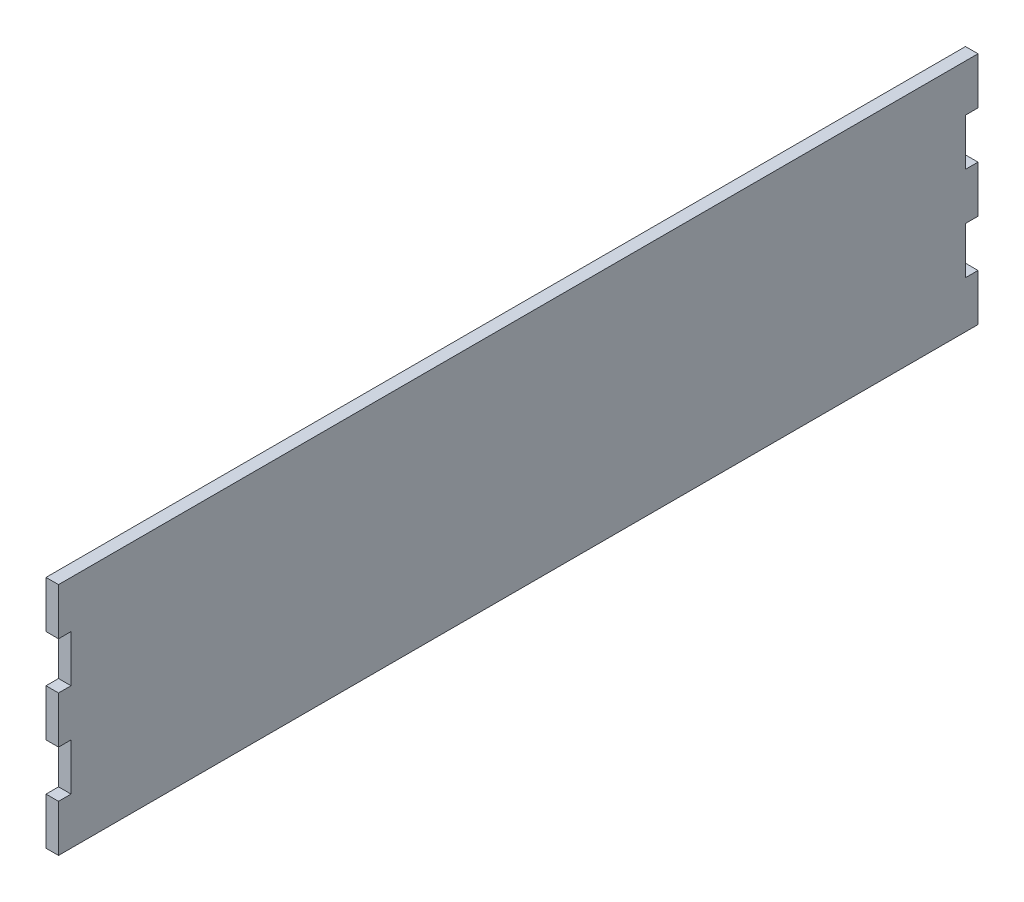
ISO-10303-21;
HEADER;
FILE_DESCRIPTION(('STEP AP214'),'2;1');
FILE_NAME('part.step','',(''),(''),'','','');
FILE_SCHEMA(('AUTOMOTIVE_DESIGN { 1 0 10303 214 1 1 1 1 }'));
ENDSEC;
DATA;
#1=APPLICATION_CONTEXT('core data for automotive mechanical design processes');
#2=APPLICATION_PROTOCOL_DEFINITION('international standard','automotive_design',2000,#1);
#3=PRODUCT_CONTEXT('',#1,'mechanical');
#4=PRODUCT('Part','Part','',(#3));
#5=PRODUCT_RELATED_PRODUCT_CATEGORY('part','',(#4));
#6=PRODUCT_DEFINITION_FORMATION('','',#4);
#7=PRODUCT_DEFINITION_CONTEXT('part definition',#1,'design');
#8=PRODUCT_DEFINITION('design','',#6,#7);
#9=PRODUCT_DEFINITION_SHAPE('','',#8);
#10=(LENGTH_UNIT() NAMED_UNIT(*) SI_UNIT(.MILLI.,.METRE.));
#11=(NAMED_UNIT(*) PLANE_ANGLE_UNIT() SI_UNIT($,.RADIAN.));
#12=(NAMED_UNIT(*) SI_UNIT($,.STERADIAN.) SOLID_ANGLE_UNIT());
#13=UNCERTAINTY_MEASURE_WITH_UNIT(LENGTH_MEASURE(1.E-05),#10,'distance_accuracy_value','');
#14=(GEOMETRIC_REPRESENTATION_CONTEXT(3) GLOBAL_UNCERTAINTY_ASSIGNED_CONTEXT((#13)) GLOBAL_UNIT_ASSIGNED_CONTEXT((#10,
#11,#12)) REPRESENTATION_CONTEXT('',''));
#15=CARTESIAN_POINT('',(0.,0.,0.));
#16=DIRECTION('',(0.,0.,1.));
#17=DIRECTION('',(1.,0.,0.));
#18=AXIS2_PLACEMENT_3D('',#15,#16,#17);
#19=CARTESIAN_POINT('',(4.,-7.74816910527764,-147.));
#20=DIRECTION('',(0.,1.,0.));
#21=DIRECTION('',(0.,0.,1.));
#22=AXIS2_PLACEMENT_3D('',#19,#20,#21);
#23=PLANE('',#22);
#24=DIRECTION('',(0.,0.,-1.));
#25=VECTOR('',#24,1.);
#26=CARTESIAN_POINT('',(0.,-7.74816910527764,-147.));
#27=LINE('',#26,#25);
#28=CARTESIAN_POINT('',(0.,-7.74816910527764,-143.));
#29=VERTEX_POINT('',#28);
#30=CARTESIAN_POINT('',(0.,-7.74816910527764,-147.));
#31=VERTEX_POINT('',#30);
#32=EDGE_CURVE('E206',#29,#31,#27,.T.);
#33=ORIENTED_EDGE('',*,*,#32,.T.);
#34=DIRECTION('',(-1.,0.,0.));
#35=VECTOR('',#34,1.);
#36=CARTESIAN_POINT('',(4.,-7.74816910527764,-147.));
#37=LINE('',#36,#35);
#38=CARTESIAN_POINT('',(4.,-7.74816910527764,-147.));
#39=VERTEX_POINT('',#38);
#40=EDGE_CURVE('E11',#39,#31,#37,.T.);
#41=ORIENTED_EDGE('',*,*,#40,.F.);
#42=DIRECTION('',(0.,0.,-1.));
#43=VECTOR('',#42,1.);
#44=CARTESIAN_POINT('',(4.,-7.74816910527764,-147.));
#45=LINE('',#44,#43);
#46=CARTESIAN_POINT('',(4.,-7.74816910527764,-143.));
#47=VERTEX_POINT('',#46);
#48=EDGE_CURVE('E244',#47,#39,#45,.T.);
#49=ORIENTED_EDGE('',*,*,#48,.F.);
#50=DIRECTION('',(-1.,0.,0.));
#51=VECTOR('',#50,1.);
#52=CARTESIAN_POINT('',(4.,-7.74816910527764,-143.));
#53=LINE('',#52,#51);
#54=EDGE_CURVE('E202',#47,#29,#53,.T.);
#55=ORIENTED_EDGE('',*,*,#54,.T.);
#56=EDGE_LOOP('',(#33,#41,#49,#55));
#57=FACE_BOUND('',#56,.T.);
#58=ADVANCED_FACE('F38',(#57),#23,.F.);
#59=CARTESIAN_POINT('',(4.,7.25183089472235,-147.));
#60=DIRECTION('',(0.,0.,1.));
#61=DIRECTION('',(0.,-1.,0.));
#62=AXIS2_PLACEMENT_3D('',#59,#60,#61);
#63=PLANE('',#62);
#64=DIRECTION('',(0.,1.,0.));
#65=VECTOR('',#64,1.);
#66=CARTESIAN_POINT('',(0.,7.25183089472235,-147.));
#67=LINE('',#66,#65);
#68=CARTESIAN_POINT('',(0.,7.25183089472235,-147.));
#69=VERTEX_POINT('',#68);
#70=EDGE_CURVE('E209',#31,#69,#67,.T.);
#71=ORIENTED_EDGE('',*,*,#70,.T.);
#72=DIRECTION('',(-1.,0.,0.));
#73=VECTOR('',#72,1.);
#74=CARTESIAN_POINT('',(4.,7.25183089472235,-147.));
#75=LINE('',#74,#73);
#76=CARTESIAN_POINT('',(4.,7.25183089472235,-147.));
#77=VERTEX_POINT('',#76);
#78=EDGE_CURVE('E46',#77,#69,#75,.T.);
#79=ORIENTED_EDGE('',*,*,#78,.F.);
#80=DIRECTION('',(0.,1.,0.));
#81=VECTOR('',#80,1.);
#82=CARTESIAN_POINT('',(4.,7.25183089472235,-147.));
#83=LINE('',#82,#81);
#84=EDGE_CURVE('E133',#39,#77,#83,.T.);
#85=ORIENTED_EDGE('',*,*,#84,.F.);
#86=ORIENTED_EDGE('',*,*,#40,.T.);
#87=EDGE_LOOP('',(#71,#79,#85,#86));
#88=FACE_BOUND('',#87,.T.);
#89=ADVANCED_FACE('F362',(#88),#63,.F.);
#90=CARTESIAN_POINT('',(4.,7.25183089472235,-147.));
#91=DIRECTION('',(0.,-1.,0.));
#92=DIRECTION('',(0.,0.,-1.));
#93=AXIS2_PLACEMENT_3D('',#90,#91,#92);
#94=PLANE('',#93);
#95=DIRECTION('',(0.,0.,1.));
#96=VECTOR('',#95,1.);
#97=CARTESIAN_POINT('',(0.,7.25183089472235,-147.));
#98=LINE('',#97,#96);
#99=CARTESIAN_POINT('',(0.,7.25183089472235,-143.));
#100=VERTEX_POINT('',#99);
#101=EDGE_CURVE('E211',#69,#100,#98,.T.);
#102=ORIENTED_EDGE('',*,*,#101,.T.);
#103=DIRECTION('',(-1.,0.,0.));
#104=VECTOR('',#103,1.);
#105=CARTESIAN_POINT('',(4.,7.25183089472235,-143.));
#106=LINE('',#105,#104);
#107=CARTESIAN_POINT('',(4.,7.25183089472235,-143.));
#108=VERTEX_POINT('',#107);
#109=EDGE_CURVE('E287',#108,#100,#106,.T.);
#110=ORIENTED_EDGE('',*,*,#109,.F.);
#111=DIRECTION('',(0.,0.,1.));
#112=VECTOR('',#111,1.);
#113=CARTESIAN_POINT('',(4.,7.25183089472235,-147.));
#114=LINE('',#113,#112);
#115=EDGE_CURVE('E295',#77,#108,#114,.T.);
#116=ORIENTED_EDGE('',*,*,#115,.F.);
#117=ORIENTED_EDGE('',*,*,#78,.T.);
#118=EDGE_LOOP('',(#102,#110,#116,#117));
#119=FACE_BOUND('',#118,.T.);
#120=ADVANCED_FACE('F293',(#119),#94,.F.);
#121=CARTESIAN_POINT('',(4.,22.2518308947224,-143.));
#122=DIRECTION('',(0.,0.,1.));
#123=DIRECTION('',(0.,-1.,0.));
#124=AXIS2_PLACEMENT_3D('',#121,#122,#123);
#125=PLANE('',#124);
#126=DIRECTION('',(0.,1.,0.));
#127=VECTOR('',#126,1.);
#128=CARTESIAN_POINT('',(0.,22.2518308947224,-143.));
#129=LINE('',#128,#127);
#130=CARTESIAN_POINT('',(0.,22.2518308947224,-143.));
#131=VERTEX_POINT('',#130);
#132=EDGE_CURVE('E213',#100,#131,#129,.T.);
#133=ORIENTED_EDGE('',*,*,#132,.T.);
#134=DIRECTION('',(-1.,0.,0.));
#135=VECTOR('',#134,1.);
#136=CARTESIAN_POINT('',(4.,22.2518308947224,-143.));
#137=LINE('',#136,#135);
#138=CARTESIAN_POINT('',(4.,22.2518308947224,-143.));
#139=VERTEX_POINT('',#138);
#140=EDGE_CURVE('E284',#139,#131,#137,.T.);
#141=ORIENTED_EDGE('',*,*,#140,.F.);
#142=DIRECTION('',(0.,1.,0.));
#143=VECTOR('',#142,1.);
#144=CARTESIAN_POINT('',(4.,22.2518308947224,-143.));
#145=LINE('',#144,#143);
#146=EDGE_CURVE('E313',#108,#139,#145,.T.);
#147=ORIENTED_EDGE('',*,*,#146,.F.);
#148=ORIENTED_EDGE('',*,*,#109,.T.);
#149=EDGE_LOOP('',(#133,#141,#147,#148));
#150=FACE_BOUND('',#149,.T.);
#151=ADVANCED_FACE('F304',(#150),#125,.F.);
#152=CARTESIAN_POINT('',(4.,22.2518308947224,-147.));
#153=DIRECTION('',(0.,1.,0.));
#154=DIRECTION('',(0.,0.,1.));
#155=AXIS2_PLACEMENT_3D('',#152,#153,#154);
#156=PLANE('',#155);
#157=DIRECTION('',(0.,0.,-1.));
#158=VECTOR('',#157,1.);
#159=CARTESIAN_POINT('',(0.,22.2518308947224,-147.));
#160=LINE('',#159,#158);
#161=CARTESIAN_POINT('',(0.,22.2518308947224,-147.));
#162=VERTEX_POINT('',#161);
#163=EDGE_CURVE('E215',#131,#162,#160,.T.);
#164=ORIENTED_EDGE('',*,*,#163,.T.);
#165=DIRECTION('',(-1.,0.,0.));
#166=VECTOR('',#165,1.);
#167=CARTESIAN_POINT('',(4.,22.2518308947224,-147.));
#168=LINE('',#167,#166);
#169=CARTESIAN_POINT('',(4.,22.2518308947224,-147.));
#170=VERTEX_POINT('',#169);
#171=EDGE_CURVE('E281',#170,#162,#168,.T.);
#172=ORIENTED_EDGE('',*,*,#171,.F.);
#173=DIRECTION('',(0.,0.,-1.));
#174=VECTOR('',#173,1.);
#175=CARTESIAN_POINT('',(4.,22.2518308947224,-147.));
#176=LINE('',#175,#174);
#177=EDGE_CURVE('E310',#139,#170,#176,.T.);
#178=ORIENTED_EDGE('',*,*,#177,.F.);
#179=ORIENTED_EDGE('',*,*,#140,.T.);
#180=EDGE_LOOP('',(#164,#172,#178,#179));
#181=FACE_BOUND('',#180,.T.);
#182=ADVANCED_FACE('F308',(#181),#156,.F.);
#183=CARTESIAN_POINT('',(4.,37.2518308947224,-147.));
#184=DIRECTION('',(0.,0.,1.));
#185=DIRECTION('',(1.,0.,0.));
#186=AXIS2_PLACEMENT_3D('',#183,#184,#185);
#187=PLANE('',#186);
#188=DIRECTION('',(0.,1.,0.));
#189=VECTOR('',#188,1.);
#190=CARTESIAN_POINT('',(0.,37.2518308947224,-147.));
#191=LINE('',#190,#189);
#192=CARTESIAN_POINT('',(0.,37.2518308947224,-147.));
#193=VERTEX_POINT('',#192);
#194=EDGE_CURVE('E217',#162,#193,#191,.T.);
#195=ORIENTED_EDGE('',*,*,#194,.T.);
#196=DIRECTION('',(-1.,0.,0.));
#197=VECTOR('',#196,1.);
#198=CARTESIAN_POINT('',(4.,37.2518308947224,-147.));
#199=LINE('',#198,#197);
#200=CARTESIAN_POINT('',(4.,37.2518308947224,-147.));
#201=VERTEX_POINT('',#200);
#202=EDGE_CURVE('E278',#201,#193,#199,.T.);
#203=ORIENTED_EDGE('',*,*,#202,.F.);
#204=DIRECTION('',(0.,1.,0.));
#205=VECTOR('',#204,1.);
#206=CARTESIAN_POINT('',(4.,37.2518308947224,-147.));
#207=LINE('',#206,#205);
#208=EDGE_CURVE('E312',#170,#201,#207,.T.);
#209=ORIENTED_EDGE('',*,*,#208,.F.);
#210=ORIENTED_EDGE('',*,*,#171,.T.);
#211=EDGE_LOOP('',(#195,#203,#209,#210));
#212=FACE_BOUND('',#211,.T.);
#213=ADVANCED_FACE('F375',(#212),#187,.F.);
#214=CARTESIAN_POINT('',(4.,37.2518308947223,147.));
#215=DIRECTION('',(0.,-1.,0.));
#216=DIRECTION('',(0.,0.,-1.));
#217=AXIS2_PLACEMENT_3D('',#214,#215,#216);
#218=PLANE('',#217);
#219=DIRECTION('',(0.,0.,1.));
#220=VECTOR('',#219,1.);
#221=CARTESIAN_POINT('',(0.,37.2518308947223,147.));
#222=LINE('',#221,#220);
#223=CARTESIAN_POINT('',(0.,37.2518308947223,147.));
#224=VERTEX_POINT('',#223);
#225=EDGE_CURVE('E219',#193,#224,#222,.T.);
#226=ORIENTED_EDGE('',*,*,#225,.T.);
#227=DIRECTION('',(-1.,0.,0.));
#228=VECTOR('',#227,1.);
#229=CARTESIAN_POINT('',(4.,37.2518308947223,147.));
#230=LINE('',#229,#228);
#231=CARTESIAN_POINT('',(4.,37.2518308947223,147.));
#232=VERTEX_POINT('',#231);
#233=EDGE_CURVE('E275',#232,#224,#230,.T.);
#234=ORIENTED_EDGE('',*,*,#233,.F.);
#235=DIRECTION('',(0.,0.,1.));
#236=VECTOR('',#235,1.);
#237=CARTESIAN_POINT('',(4.,37.2518308947223,147.));
#238=LINE('',#237,#236);
#239=EDGE_CURVE('E315',#201,#232,#238,.T.);
#240=ORIENTED_EDGE('',*,*,#239,.F.);
#241=ORIENTED_EDGE('',*,*,#202,.T.);
#242=EDGE_LOOP('',(#226,#234,#240,#241));
#243=FACE_BOUND('',#242,.T.);
#244=ADVANCED_FACE('F378',(#243),#218,.F.);
#245=CARTESIAN_POINT('',(4.,37.2518308947223,147.));
#246=DIRECTION('',(0.,0.,-1.));
#247=DIRECTION('',(-1.,0.,0.));
#248=AXIS2_PLACEMENT_3D('',#245,#246,#247);
#249=PLANE('',#248);
#250=DIRECTION('',(0.,-1.,0.));
#251=VECTOR('',#250,1.);
#252=CARTESIAN_POINT('',(0.,37.2518308947223,147.));
#253=LINE('',#252,#251);
#254=CARTESIAN_POINT('',(0.,22.2518308947223,147.));
#255=VERTEX_POINT('',#254);
#256=EDGE_CURVE('E221',#224,#255,#253,.T.);
#257=ORIENTED_EDGE('',*,*,#256,.T.);
#258=DIRECTION('',(-1.,0.,0.));
#259=VECTOR('',#258,1.);
#260=CARTESIAN_POINT('',(4.,22.2518308947223,147.));
#261=LINE('',#260,#259);
#262=CARTESIAN_POINT('',(4.,22.2518308947223,147.));
#263=VERTEX_POINT('',#262);
#264=EDGE_CURVE('E272',#263,#255,#261,.T.);
#265=ORIENTED_EDGE('',*,*,#264,.F.);
#266=DIRECTION('',(0.,-1.,0.));
#267=VECTOR('',#266,1.);
#268=CARTESIAN_POINT('',(4.,37.2518308947223,147.));
#269=LINE('',#268,#267);
#270=EDGE_CURVE('E321',#232,#263,#269,.T.);
#271=ORIENTED_EDGE('',*,*,#270,.F.);
#272=ORIENTED_EDGE('',*,*,#233,.T.);
#273=EDGE_LOOP('',(#257,#265,#271,#272));
#274=FACE_BOUND('',#273,.T.);
#275=ADVANCED_FACE('F382',(#274),#249,.F.);
#276=CARTESIAN_POINT('',(4.,22.2518308947223,147.));
#277=DIRECTION('',(0.,1.,0.));
#278=DIRECTION('',(0.,0.,1.));
#279=AXIS2_PLACEMENT_3D('',#276,#277,#278);
#280=PLANE('',#279);
#281=DIRECTION('',(0.,0.,-1.));
#282=VECTOR('',#281,1.);
#283=CARTESIAN_POINT('',(0.,22.2518308947223,147.));
#284=LINE('',#283,#282);
#285=CARTESIAN_POINT('',(0.,22.2518308947223,143.));
#286=VERTEX_POINT('',#285);
#287=EDGE_CURVE('E223',#255,#286,#284,.T.);
#288=ORIENTED_EDGE('',*,*,#287,.T.);
#289=DIRECTION('',(-1.,0.,0.));
#290=VECTOR('',#289,1.);
#291=CARTESIAN_POINT('',(4.,22.2518308947223,143.));
#292=LINE('',#291,#290);
#293=CARTESIAN_POINT('',(4.,22.2518308947223,143.));
#294=VERTEX_POINT('',#293);
#295=EDGE_CURVE('E269',#294,#286,#292,.T.);
#296=ORIENTED_EDGE('',*,*,#295,.F.);
#297=DIRECTION('',(0.,0.,-1.));
#298=VECTOR('',#297,1.);
#299=CARTESIAN_POINT('',(4.,22.2518308947223,147.));
#300=LINE('',#299,#298);
#301=EDGE_CURVE('E323',#263,#294,#300,.T.);
#302=ORIENTED_EDGE('',*,*,#301,.F.);
#303=ORIENTED_EDGE('',*,*,#264,.T.);
#304=EDGE_LOOP('',(#288,#296,#302,#303));
#305=FACE_BOUND('',#304,.T.);
#306=ADVANCED_FACE('F386',(#305),#280,.F.);
#307=CARTESIAN_POINT('',(4.,22.2518308947223,143.));
#308=DIRECTION('',(0.,0.,-1.));
#309=DIRECTION('',(0.,1.,0.));
#310=AXIS2_PLACEMENT_3D('',#307,#308,#309);
#311=PLANE('',#310);
#312=DIRECTION('',(0.,-1.,0.));
#313=VECTOR('',#312,1.);
#314=CARTESIAN_POINT('',(0.,22.2518308947223,143.));
#315=LINE('',#314,#313);
#316=CARTESIAN_POINT('',(0.,7.25183089472232,143.));
#317=VERTEX_POINT('',#316);
#318=EDGE_CURVE('E225',#286,#317,#315,.T.);
#319=ORIENTED_EDGE('',*,*,#318,.T.);
#320=DIRECTION('',(-1.,0.,0.));
#321=VECTOR('',#320,1.);
#322=CARTESIAN_POINT('',(4.,7.25183089472232,143.));
#323=LINE('',#322,#321);
#324=CARTESIAN_POINT('',(4.,7.25183089472232,143.));
#325=VERTEX_POINT('',#324);
#326=EDGE_CURVE('E266',#325,#317,#323,.T.);
#327=ORIENTED_EDGE('',*,*,#326,.F.);
#328=DIRECTION('',(0.,-1.,0.));
#329=VECTOR('',#328,1.);
#330=CARTESIAN_POINT('',(4.,22.2518308947223,143.));
#331=LINE('',#330,#329);
#332=EDGE_CURVE('E325',#294,#325,#331,.T.);
#333=ORIENTED_EDGE('',*,*,#332,.F.);
#334=ORIENTED_EDGE('',*,*,#295,.T.);
#335=EDGE_LOOP('',(#319,#327,#333,#334));
#336=FACE_BOUND('',#335,.T.);
#337=ADVANCED_FACE('F390',(#336),#311,.F.);
#338=CARTESIAN_POINT('',(4.,7.25183089472232,147.));
#339=DIRECTION('',(0.,-1.,0.));
#340=DIRECTION('',(0.,0.,-1.));
#341=AXIS2_PLACEMENT_3D('',#338,#339,#340);
#342=PLANE('',#341);
#343=DIRECTION('',(0.,0.,1.));
#344=VECTOR('',#343,1.);
#345=CARTESIAN_POINT('',(0.,7.25183089472232,147.));
#346=LINE('',#345,#344);
#347=CARTESIAN_POINT('',(0.,7.25183089472232,147.));
#348=VERTEX_POINT('',#347);
#349=EDGE_CURVE('E227',#317,#348,#346,.T.);
#350=ORIENTED_EDGE('',*,*,#349,.T.);
#351=DIRECTION('',(-1.,0.,0.));
#352=VECTOR('',#351,1.);
#353=CARTESIAN_POINT('',(4.,7.25183089472232,147.));
#354=LINE('',#353,#352);
#355=CARTESIAN_POINT('',(4.,7.25183089472232,147.));
#356=VERTEX_POINT('',#355);
#357=EDGE_CURVE('E263',#356,#348,#354,.T.);
#358=ORIENTED_EDGE('',*,*,#357,.F.);
#359=DIRECTION('',(0.,0.,1.));
#360=VECTOR('',#359,1.);
#361=CARTESIAN_POINT('',(4.,7.25183089472232,147.));
#362=LINE('',#361,#360);
#363=EDGE_CURVE('E327',#325,#356,#362,.T.);
#364=ORIENTED_EDGE('',*,*,#363,.F.);
#365=ORIENTED_EDGE('',*,*,#326,.T.);
#366=EDGE_LOOP('',(#350,#358,#364,#365));
#367=FACE_BOUND('',#366,.T.);
#368=ADVANCED_FACE('F394',(#367),#342,.F.);
#369=CARTESIAN_POINT('',(4.,7.25183089472232,147.));
#370=DIRECTION('',(0.,0.,-1.));
#371=DIRECTION('',(0.,1.,0.));
#372=AXIS2_PLACEMENT_3D('',#369,#370,#371);
#373=PLANE('',#372);
#374=DIRECTION('',(0.,-1.,0.));
#375=VECTOR('',#374,1.);
#376=CARTESIAN_POINT('',(0.,7.25183089472232,147.));
#377=LINE('',#376,#375);
#378=CARTESIAN_POINT('',(0.,-7.74816910527768,147.));
#379=VERTEX_POINT('',#378);
#380=EDGE_CURVE('E229',#348,#379,#377,.T.);
#381=ORIENTED_EDGE('',*,*,#380,.T.);
#382=DIRECTION('',(-1.,0.,0.));
#383=VECTOR('',#382,1.);
#384=CARTESIAN_POINT('',(4.,-7.74816910527768,147.));
#385=LINE('',#384,#383);
#386=CARTESIAN_POINT('',(4.,-7.74816910527768,147.));
#387=VERTEX_POINT('',#386);
#388=EDGE_CURVE('E260',#387,#379,#385,.T.);
#389=ORIENTED_EDGE('',*,*,#388,.F.);
#390=DIRECTION('',(0.,-1.,0.));
#391=VECTOR('',#390,1.);
#392=CARTESIAN_POINT('',(4.,7.25183089472232,147.));
#393=LINE('',#392,#391);
#394=EDGE_CURVE('E329',#356,#387,#393,.T.);
#395=ORIENTED_EDGE('',*,*,#394,.F.);
#396=ORIENTED_EDGE('',*,*,#357,.T.);
#397=EDGE_LOOP('',(#381,#389,#395,#396));
#398=FACE_BOUND('',#397,.T.);
#399=ADVANCED_FACE('F398',(#398),#373,.F.);
#400=CARTESIAN_POINT('',(4.,-7.74816910527768,147.));
#401=DIRECTION('',(0.,1.,0.));
#402=DIRECTION('',(0.,0.,1.));
#403=AXIS2_PLACEMENT_3D('',#400,#401,#402);
#404=PLANE('',#403);
#405=DIRECTION('',(0.,0.,-1.));
#406=VECTOR('',#405,1.);
#407=CARTESIAN_POINT('',(0.,-7.74816910527768,147.));
#408=LINE('',#407,#406);
#409=CARTESIAN_POINT('',(0.,-7.74816910527768,143.));
#410=VERTEX_POINT('',#409);
#411=EDGE_CURVE('E231',#379,#410,#408,.T.);
#412=ORIENTED_EDGE('',*,*,#411,.T.);
#413=DIRECTION('',(-1.,0.,0.));
#414=VECTOR('',#413,1.);
#415=CARTESIAN_POINT('',(4.,-7.74816910527768,143.));
#416=LINE('',#415,#414);
#417=CARTESIAN_POINT('',(4.,-7.74816910527768,143.));
#418=VERTEX_POINT('',#417);
#419=EDGE_CURVE('E257',#418,#410,#416,.T.);
#420=ORIENTED_EDGE('',*,*,#419,.F.);
#421=DIRECTION('',(0.,0.,-1.));
#422=VECTOR('',#421,1.);
#423=CARTESIAN_POINT('',(4.,-7.74816910527768,147.));
#424=LINE('',#423,#422);
#425=EDGE_CURVE('E331',#387,#418,#424,.T.);
#426=ORIENTED_EDGE('',*,*,#425,.F.);
#427=ORIENTED_EDGE('',*,*,#388,.T.);
#428=EDGE_LOOP('',(#412,#420,#426,#427));
#429=FACE_BOUND('',#428,.T.);
#430=ADVANCED_FACE('F402',(#429),#404,.F.);
#431=CARTESIAN_POINT('',(4.,-7.74816910527768,143.));
#432=DIRECTION('',(0.,0.,-1.));
#433=DIRECTION('',(0.,1.,0.));
#434=AXIS2_PLACEMENT_3D('',#431,#432,#433);
#435=PLANE('',#434);
#436=DIRECTION('',(0.,-1.,0.));
#437=VECTOR('',#436,1.);
#438=CARTESIAN_POINT('',(0.,-7.74816910527768,143.));
#439=LINE('',#438,#437);
#440=CARTESIAN_POINT('',(0.,-22.7481691052777,142.999999999999));
#441=VERTEX_POINT('',#440);
#442=EDGE_CURVE('E233',#410,#441,#439,.T.);
#443=ORIENTED_EDGE('',*,*,#442,.T.);
#444=DIRECTION('',(-1.,0.,0.));
#445=VECTOR('',#444,1.);
#446=CARTESIAN_POINT('',(4.,-22.7481691052777,142.999999999999));
#447=LINE('',#446,#445);
#448=CARTESIAN_POINT('',(4.,-22.7481691052777,142.999999999999));
#449=VERTEX_POINT('',#448);
#450=EDGE_CURVE('E254',#449,#441,#447,.T.);
#451=ORIENTED_EDGE('',*,*,#450,.F.);
#452=DIRECTION('',(0.,-1.,0.));
#453=VECTOR('',#452,1.);
#454=CARTESIAN_POINT('',(4.,-7.74816910527768,143.));
#455=LINE('',#454,#453);
#456=EDGE_CURVE('E333',#418,#449,#455,.T.);
#457=ORIENTED_EDGE('',*,*,#456,.F.);
#458=ORIENTED_EDGE('',*,*,#419,.T.);
#459=EDGE_LOOP('',(#443,#451,#457,#458));
#460=FACE_BOUND('',#459,.T.);
#461=ADVANCED_FACE('F406',(#460),#435,.F.);
#462=CARTESIAN_POINT('',(4.,-22.7481691052777,146.999999999999));
#463=DIRECTION('',(0.,-1.,0.));
#464=DIRECTION('',(0.,0.,-1.));
#465=AXIS2_PLACEMENT_3D('',#462,#463,#464);
#466=PLANE('',#465);
#467=DIRECTION('',(0.,0.,1.));
#468=VECTOR('',#467,1.);
#469=CARTESIAN_POINT('',(0.,-22.7481691052777,146.999999999999));
#470=LINE('',#469,#468);
#471=CARTESIAN_POINT('',(0.,-22.7481691052777,146.999999999999));
#472=VERTEX_POINT('',#471);
#473=EDGE_CURVE('E235',#441,#472,#470,.T.);
#474=ORIENTED_EDGE('',*,*,#473,.T.);
#475=DIRECTION('',(-1.,0.,0.));
#476=VECTOR('',#475,1.);
#477=CARTESIAN_POINT('',(4.,-22.7481691052777,146.999999999999));
#478=LINE('',#477,#476);
#479=CARTESIAN_POINT('',(4.,-22.7481691052777,146.999999999999));
#480=VERTEX_POINT('',#479);
#481=EDGE_CURVE('E251',#480,#472,#478,.T.);
#482=ORIENTED_EDGE('',*,*,#481,.F.);
#483=DIRECTION('',(0.,0.,1.));
#484=VECTOR('',#483,1.);
#485=CARTESIAN_POINT('',(4.,-22.7481691052777,146.999999999999));
#486=LINE('',#485,#484);
#487=EDGE_CURVE('E335',#449,#480,#486,.T.);
#488=ORIENTED_EDGE('',*,*,#487,.F.);
#489=ORIENTED_EDGE('',*,*,#450,.T.);
#490=EDGE_LOOP('',(#474,#482,#488,#489));
#491=FACE_BOUND('',#490,.T.);
#492=ADVANCED_FACE('F410',(#491),#466,.F.);
#493=CARTESIAN_POINT('',(4.,-22.7481691052777,146.999999999999));
#494=DIRECTION('',(0.,0.,-1.));
#495=DIRECTION('',(0.,1.,0.));
#496=AXIS2_PLACEMENT_3D('',#493,#494,#495);
#497=PLANE('',#496);
#498=DIRECTION('',(0.,-1.,0.));
#499=VECTOR('',#498,1.);
#500=CARTESIAN_POINT('',(0.,-22.7481691052777,146.999999999999));
#501=LINE('',#500,#499);
#502=CARTESIAN_POINT('',(0.,-37.7481691052777,147.));
#503=VERTEX_POINT('',#502);
#504=EDGE_CURVE('E237',#472,#503,#501,.T.);
#505=ORIENTED_EDGE('',*,*,#504,.T.);
#506=DIRECTION('',(-1.,0.,0.));
#507=VECTOR('',#506,1.);
#508=CARTESIAN_POINT('',(4.,-37.7481691052777,147.));
#509=LINE('',#508,#507);
#510=CARTESIAN_POINT('',(4.,-37.7481691052777,147.));
#511=VERTEX_POINT('',#510);
#512=EDGE_CURVE('E248',#511,#503,#509,.T.);
#513=ORIENTED_EDGE('',*,*,#512,.F.);
#514=DIRECTION('',(0.,-1.,0.));
#515=VECTOR('',#514,1.);
#516=CARTESIAN_POINT('',(4.,-22.7481691052777,146.999999999999));
#517=LINE('',#516,#515);
#518=EDGE_CURVE('E337',#480,#511,#517,.T.);
#519=ORIENTED_EDGE('',*,*,#518,.F.);
#520=ORIENTED_EDGE('',*,*,#481,.T.);
#521=EDGE_LOOP('',(#505,#513,#519,#520));
#522=FACE_BOUND('',#521,.T.);
#523=ADVANCED_FACE('F343',(#522),#497,.F.);
#524=CARTESIAN_POINT('',(4.,-37.7481691052777,147.));
#525=DIRECTION('',(0.,1.,0.));
#526=DIRECTION('',(0.,0.,1.));
#527=AXIS2_PLACEMENT_3D('',#524,#525,#526);
#528=PLANE('',#527);
#529=DIRECTION('',(0.,0.,-1.));
#530=VECTOR('',#529,1.);
#531=CARTESIAN_POINT('',(0.,-37.7481691052777,147.));
#532=LINE('',#531,#530);
#533=CARTESIAN_POINT('',(0.,-37.7481691052777,-147.));
#534=VERTEX_POINT('',#533);
#535=EDGE_CURVE('E239',#503,#534,#532,.T.);
#536=ORIENTED_EDGE('',*,*,#535,.T.);
#537=DIRECTION('',(-1.,0.,0.));
#538=VECTOR('',#537,1.);
#539=CARTESIAN_POINT('',(4.,-37.7481691052777,-147.));
#540=LINE('',#539,#538);
#541=CARTESIAN_POINT('',(4.,-37.7481691052777,-147.));
#542=VERTEX_POINT('',#541);
#543=EDGE_CURVE('E197',#542,#534,#540,.T.);
#544=ORIENTED_EDGE('',*,*,#543,.F.);
#545=DIRECTION('',(0.,0.,-1.));
#546=VECTOR('',#545,1.);
#547=CARTESIAN_POINT('',(4.,-37.7481691052777,147.));
#548=LINE('',#547,#546);
#549=EDGE_CURVE('E188',#511,#542,#548,.T.);
#550=ORIENTED_EDGE('',*,*,#549,.F.);
#551=ORIENTED_EDGE('',*,*,#512,.T.);
#552=EDGE_LOOP('',(#536,#544,#550,#551));
#553=FACE_BOUND('',#552,.T.);
#554=ADVANCED_FACE('F347',(#553),#528,.F.);
#555=CARTESIAN_POINT('',(4.,-22.7481691052776,-147.));
#556=DIRECTION('',(0.,0.,1.));
#557=DIRECTION('',(0.,-1.,0.));
#558=AXIS2_PLACEMENT_3D('',#555,#556,#557);
#559=PLANE('',#558);
#560=DIRECTION('',(0.,1.,0.));
#561=VECTOR('',#560,1.);
#562=CARTESIAN_POINT('',(0.,-22.7481691052776,-147.));
#563=LINE('',#562,#561);
#564=CARTESIAN_POINT('',(0.,-22.7481691052776,-147.));
#565=VERTEX_POINT('',#564);
#566=EDGE_CURVE('E196',#534,#565,#563,.T.);
#567=ORIENTED_EDGE('',*,*,#566,.T.);
#568=DIRECTION('',(-1.,0.,0.));
#569=VECTOR('',#568,1.);
#570=CARTESIAN_POINT('',(4.,-22.7481691052776,-147.));
#571=LINE('',#570,#569);
#572=CARTESIAN_POINT('',(4.,-22.7481691052776,-147.));
#573=VERTEX_POINT('',#572);
#574=EDGE_CURVE('E193',#573,#565,#571,.T.);
#575=ORIENTED_EDGE('',*,*,#574,.F.);
#576=DIRECTION('',(0.,1.,0.));
#577=VECTOR('',#576,1.);
#578=CARTESIAN_POINT('',(4.,-22.7481691052776,-147.));
#579=LINE('',#578,#577);
#580=EDGE_CURVE('E182',#542,#573,#579,.T.);
#581=ORIENTED_EDGE('',*,*,#580,.F.);
#582=ORIENTED_EDGE('',*,*,#543,.T.);
#583=EDGE_LOOP('',(#567,#575,#581,#582));
#584=FACE_BOUND('',#583,.T.);
#585=ADVANCED_FACE('F194',(#584),#559,.F.);
#586=CARTESIAN_POINT('',(4.,-22.7481691052776,-147.));
#587=DIRECTION('',(0.,-1.,0.));
#588=DIRECTION('',(0.,0.,-1.));
#589=AXIS2_PLACEMENT_3D('',#586,#587,#588);
#590=PLANE('',#589);
#591=DIRECTION('',(0.,0.,1.));
#592=VECTOR('',#591,1.);
#593=CARTESIAN_POINT('',(0.,-22.7481691052776,-147.));
#594=LINE('',#593,#592);
#595=CARTESIAN_POINT('',(0.,-22.7481691052776,-143.));
#596=VERTEX_POINT('',#595);
#597=EDGE_CURVE('E119',#565,#596,#594,.T.);
#598=ORIENTED_EDGE('',*,*,#597,.T.);
#599=DIRECTION('',(-1.,0.,0.));
#600=VECTOR('',#599,1.);
#601=CARTESIAN_POINT('',(4.,-22.7481691052776,-143.));
#602=LINE('',#601,#600);
#603=CARTESIAN_POINT('',(4.,-22.7481691052776,-143.));
#604=VERTEX_POINT('',#603);
#605=EDGE_CURVE('E198',#604,#596,#602,.T.);
#606=ORIENTED_EDGE('',*,*,#605,.F.);
#607=DIRECTION('',(0.,0.,1.));
#608=VECTOR('',#607,1.);
#609=CARTESIAN_POINT('',(4.,-22.7481691052776,-147.));
#610=LINE('',#609,#608);
#611=EDGE_CURVE('E186',#573,#604,#610,.T.);
#612=ORIENTED_EDGE('',*,*,#611,.F.);
#613=ORIENTED_EDGE('',*,*,#574,.T.);
#614=EDGE_LOOP('',(#598,#606,#612,#613));
#615=FACE_BOUND('',#614,.T.);
#616=ADVANCED_FACE('F200',(#615),#590,.F.);
#617=CARTESIAN_POINT('',(4.,-7.74816910527764,-143.));
#618=DIRECTION('',(0.,0.,1.));
#619=DIRECTION('',(0.,-1.,0.));
#620=AXIS2_PLACEMENT_3D('',#617,#618,#619);
#621=PLANE('',#620);
#622=DIRECTION('',(0.,1.,0.));
#623=VECTOR('',#622,1.);
#624=CARTESIAN_POINT('',(0.,-7.74816910527764,-143.));
#625=LINE('',#624,#623);
#626=EDGE_CURVE('E125',#596,#29,#625,.T.);
#627=ORIENTED_EDGE('',*,*,#626,.T.);
#628=ORIENTED_EDGE('',*,*,#54,.F.);
#629=DIRECTION('',(0.,1.,0.));
#630=VECTOR('',#629,1.);
#631=CARTESIAN_POINT('',(4.,-7.74816910527764,-143.));
#632=LINE('',#631,#630);
#633=EDGE_CURVE('E54',#604,#47,#632,.T.);
#634=ORIENTED_EDGE('',*,*,#633,.F.);
#635=ORIENTED_EDGE('',*,*,#605,.T.);
#636=EDGE_LOOP('',(#627,#628,#634,#635));
#637=FACE_BOUND('',#636,.T.);
#638=ADVANCED_FACE('F351',(#637),#621,.F.);
#639=CARTESIAN_POINT('',(4.,0.,0.));
#640=DIRECTION('',(1.,0.,0.));
#641=DIRECTION('',(0.,0.,-1.));
#642=AXIS2_PLACEMENT_3D('',#639,#640,#641);
#643=PLANE('',#642);
#644=ORIENTED_EDGE('',*,*,#48,.T.);
#645=ORIENTED_EDGE('',*,*,#84,.T.);
#646=ORIENTED_EDGE('',*,*,#115,.T.);
#647=ORIENTED_EDGE('',*,*,#146,.T.);
#648=ORIENTED_EDGE('',*,*,#177,.T.);
#649=ORIENTED_EDGE('',*,*,#208,.T.);
#650=ORIENTED_EDGE('',*,*,#239,.T.);
#651=ORIENTED_EDGE('',*,*,#270,.T.);
#652=ORIENTED_EDGE('',*,*,#301,.T.);
#653=ORIENTED_EDGE('',*,*,#332,.T.);
#654=ORIENTED_EDGE('',*,*,#363,.T.);
#655=ORIENTED_EDGE('',*,*,#394,.T.);
#656=ORIENTED_EDGE('',*,*,#425,.T.);
#657=ORIENTED_EDGE('',*,*,#456,.T.);
#658=ORIENTED_EDGE('',*,*,#487,.T.);
#659=ORIENTED_EDGE('',*,*,#518,.T.);
#660=ORIENTED_EDGE('',*,*,#549,.T.);
#661=ORIENTED_EDGE('',*,*,#580,.T.);
#662=ORIENTED_EDGE('',*,*,#611,.T.);
#663=ORIENTED_EDGE('',*,*,#633,.T.);
#664=EDGE_LOOP('',(#644,#645,#646,#647,#648,#649,#650,#651,#652,#653,#654,#655,#656,#657,#658,
#659,#660,#661,#662,#663));
#665=FACE_BOUND('',#664,.T.);
#666=ADVANCED_FACE('F184',(#665),#643,.T.);
#667=CARTESIAN_POINT('',(0.,0.,0.));
#668=DIRECTION('',(1.,0.,0.));
#669=DIRECTION('',(0.,0.,-1.));
#670=AXIS2_PLACEMENT_3D('',#667,#668,#669);
#671=PLANE('',#670);
#672=ORIENTED_EDGE('',*,*,#32,.F.);
#673=ORIENTED_EDGE('',*,*,#626,.F.);
#674=ORIENTED_EDGE('',*,*,#597,.F.);
#675=ORIENTED_EDGE('',*,*,#566,.F.);
#676=ORIENTED_EDGE('',*,*,#535,.F.);
#677=ORIENTED_EDGE('',*,*,#504,.F.);
#678=ORIENTED_EDGE('',*,*,#473,.F.);
#679=ORIENTED_EDGE('',*,*,#442,.F.);
#680=ORIENTED_EDGE('',*,*,#411,.F.);
#681=ORIENTED_EDGE('',*,*,#380,.F.);
#682=ORIENTED_EDGE('',*,*,#349,.F.);
#683=ORIENTED_EDGE('',*,*,#318,.F.);
#684=ORIENTED_EDGE('',*,*,#287,.F.);
#685=ORIENTED_EDGE('',*,*,#256,.F.);
#686=ORIENTED_EDGE('',*,*,#225,.F.);
#687=ORIENTED_EDGE('',*,*,#194,.F.);
#688=ORIENTED_EDGE('',*,*,#163,.F.);
#689=ORIENTED_EDGE('',*,*,#132,.F.);
#690=ORIENTED_EDGE('',*,*,#101,.F.);
#691=ORIENTED_EDGE('',*,*,#70,.F.);
#692=EDGE_LOOP('',(#672,#673,#674,#675,#676,#677,#678,#679,#680,#681,#682,#683,#684,#685,#686,
#687,#688,#689,#690,#691));
#693=FACE_BOUND('',#692,.T.);
#694=ADVANCED_FACE('F299',(#693),#671,.F.);
#695=CLOSED_SHELL('',(#58,#89,#120,#151,#182,#213,#244,#275,#306,#337,#368,#399,#430,#461,#492,
#523,#554,#585,#616,#638,#666,#694));
#696=MANIFOLD_SOLID_BREP('B2',#695);
#697=ADVANCED_BREP_SHAPE_REPRESENTATION('',(#18,#696),#14);
#698=SHAPE_DEFINITION_REPRESENTATION(#9,#697);
ENDSEC;
END-ISO-10303-21;
